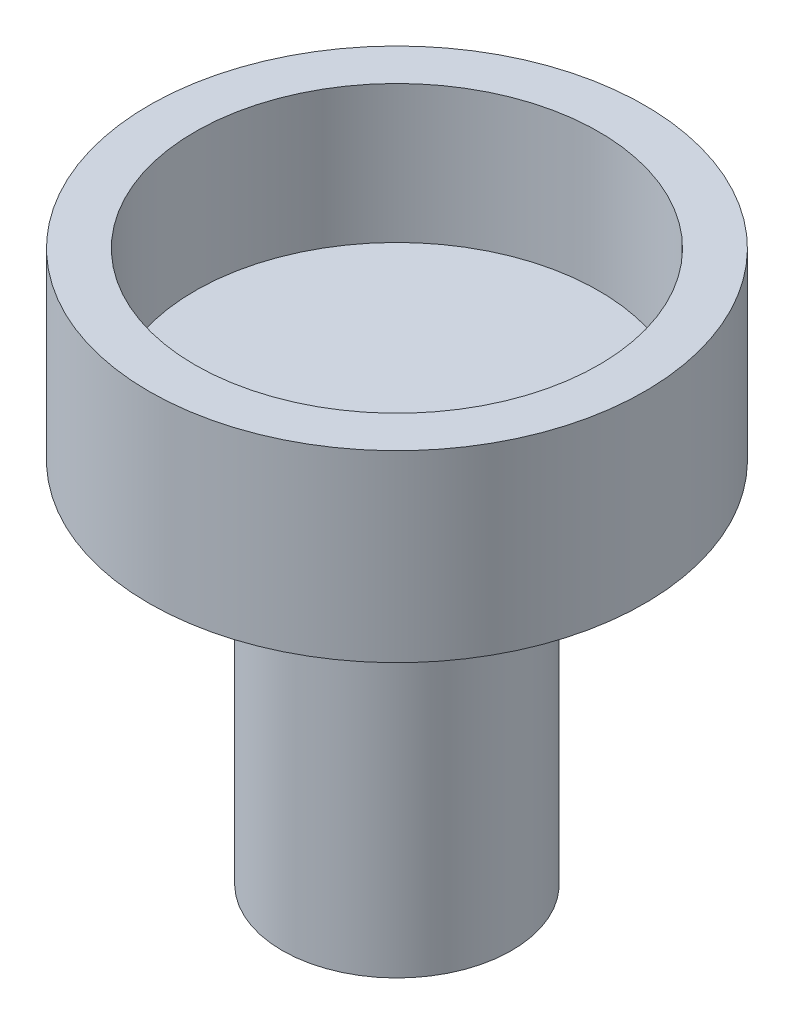
ISO-10303-21;
HEADER;
FILE_DESCRIPTION(('STEP AP214'),'2;1');
FILE_NAME('part.step','',(''),(''),'','','');
FILE_SCHEMA(('AUTOMOTIVE_DESIGN { 1 0 10303 214 1 1 1 1 }'));
ENDSEC;
DATA;
#1=APPLICATION_CONTEXT('core data for automotive mechanical design processes');
#2=APPLICATION_PROTOCOL_DEFINITION('international standard','automotive_design',2000,#1);
#3=PRODUCT_CONTEXT('',#1,'mechanical');
#4=PRODUCT('Part','Part','',(#3));
#5=PRODUCT_RELATED_PRODUCT_CATEGORY('part','',(#4));
#6=PRODUCT_DEFINITION_FORMATION('','',#4);
#7=PRODUCT_DEFINITION_CONTEXT('part definition',#1,'design');
#8=PRODUCT_DEFINITION('design','',#6,#7);
#9=PRODUCT_DEFINITION_SHAPE('','',#8);
#10=(LENGTH_UNIT() NAMED_UNIT(*) SI_UNIT(.MILLI.,.METRE.));
#11=(NAMED_UNIT(*) PLANE_ANGLE_UNIT() SI_UNIT($,.RADIAN.));
#12=(NAMED_UNIT(*) SI_UNIT($,.STERADIAN.) SOLID_ANGLE_UNIT());
#13=UNCERTAINTY_MEASURE_WITH_UNIT(LENGTH_MEASURE(1.E-05),#10,'distance_accuracy_value','');
#14=(GEOMETRIC_REPRESENTATION_CONTEXT(3) GLOBAL_UNCERTAINTY_ASSIGNED_CONTEXT((#13)) GLOBAL_UNIT_ASSIGNED_CONTEXT((#10,
#11,#12)) REPRESENTATION_CONTEXT('',''));
#15=CARTESIAN_POINT('',(0.,0.,0.));
#16=DIRECTION('',(0.,0.,1.));
#17=DIRECTION('',(1.,0.,0.));
#18=AXIS2_PLACEMENT_3D('',#15,#16,#17);
#19=CARTESIAN_POINT('',(0.,-4.,0.));
#20=DIRECTION('',(0.,1.,0.));
#21=DIRECTION('',(0.,0.,1.));
#22=AXIS2_PLACEMENT_3D('',#19,#20,#21);
#23=CYLINDRICAL_SURFACE('',#22,1.25);
#24=CARTESIAN_POINT('',(0.,-4.,0.));
#25=DIRECTION('',(0.,1.,0.));
#26=DIRECTION('',(0.,0.,1.));
#27=AXIS2_PLACEMENT_3D('',#24,#25,#26);
#28=CIRCLE('',#27,1.25);
#29=CARTESIAN_POINT('',(0.,-4.,1.25));
#30=VERTEX_POINT('',#29);
#31=EDGE_CURVE('E39',#30,#30,#28,.T.);
#32=ORIENTED_EDGE('',*,*,#31,.T.);
#33=EDGE_LOOP('',(#32));
#34=FACE_BOUND('',#33,.T.);
#35=CARTESIAN_POINT('',(0.,0.,0.));
#36=DIRECTION('',(0.,1.,0.));
#37=DIRECTION('',(0.,0.,1.));
#38=AXIS2_PLACEMENT_3D('',#35,#36,#37);
#39=CIRCLE('',#38,1.25);
#40=CARTESIAN_POINT('',(0.,0.,1.25));
#41=VERTEX_POINT('',#40);
#42=EDGE_CURVE('E43',#41,#41,#39,.T.);
#43=ORIENTED_EDGE('',*,*,#42,.F.);
#44=EDGE_LOOP('',(#43));
#45=FACE_BOUND('',#44,.T.);
#46=ADVANCED_FACE('F33',(#34,#45),#23,.T.);
#47=CARTESIAN_POINT('',(0.,-4.,0.));
#48=DIRECTION('',(0.,1.,0.));
#49=DIRECTION('',(0.,0.,1.));
#50=AXIS2_PLACEMENT_3D('',#47,#48,#49);
#51=PLANE('',#50);
#52=ORIENTED_EDGE('',*,*,#31,.F.);
#53=EDGE_LOOP('',(#52));
#54=FACE_BOUND('',#53,.T.);
#55=ADVANCED_FACE('F64',(#54),#51,.F.);
#56=CARTESIAN_POINT('',(0.,0.5,0.));
#57=DIRECTION('',(0.,-1.,0.));
#58=DIRECTION('',(0.,0.,-1.));
#59=AXIS2_PLACEMENT_3D('',#56,#57,#58);
#60=CYLINDRICAL_SURFACE('',#59,2.7);
#61=CARTESIAN_POINT('',(0.,0.,0.));
#62=DIRECTION('',(0.,1.,0.));
#63=DIRECTION('',(0.,0.,1.));
#64=AXIS2_PLACEMENT_3D('',#61,#62,#63);
#65=CIRCLE('',#64,2.7);
#66=CARTESIAN_POINT('',(0.,0.,2.7));
#67=VERTEX_POINT('',#66);
#68=EDGE_CURVE('E48',#67,#67,#65,.T.);
#69=ORIENTED_EDGE('',*,*,#68,.T.);
#70=EDGE_LOOP('',(#69));
#71=FACE_BOUND('',#70,.T.);
#72=CARTESIAN_POINT('',(0.,2.,0.));
#73=DIRECTION('',(0.,1.,0.));
#74=DIRECTION('',(0.,0.,1.));
#75=AXIS2_PLACEMENT_3D('',#72,#73,#74);
#76=CIRCLE('',#75,2.7);
#77=CARTESIAN_POINT('',(0.,2.,2.7));
#78=VERTEX_POINT('',#77);
#79=EDGE_CURVE('E52',#78,#78,#76,.T.);
#80=ORIENTED_EDGE('',*,*,#79,.F.);
#81=EDGE_LOOP('',(#80));
#82=FACE_BOUND('',#81,.T.);
#83=ADVANCED_FACE('F61',(#71,#82),#60,.T.);
#84=CARTESIAN_POINT('',(0.,0.,0.));
#85=DIRECTION('',(0.,1.,0.));
#86=DIRECTION('',(0.,0.,1.));
#87=AXIS2_PLACEMENT_3D('',#84,#85,#86);
#88=PLANE('',#87);
#89=ORIENTED_EDGE('',*,*,#42,.T.);
#90=EDGE_LOOP('',(#89));
#91=FACE_BOUND('',#90,.T.);
#92=ORIENTED_EDGE('',*,*,#68,.F.);
#93=EDGE_LOOP('',(#92));
#94=FACE_BOUND('',#93,.T.);
#95=ADVANCED_FACE('F63',(#91,#94),#88,.F.);
#96=CARTESIAN_POINT('',(0.,11.6367532368147,0.));
#97=DIRECTION('',(0.,-1.,0.));
#98=DIRECTION('',(0.,0.,-1.));
#99=AXIS2_PLACEMENT_3D('',#96,#97,#98);
#100=CYLINDRICAL_SURFACE('',#99,2.2);
#101=CARTESIAN_POINT('',(0.,0.5,0.));
#102=DIRECTION('',(0.,1.,0.));
#103=DIRECTION('',(0.,0.,1.));
#104=AXIS2_PLACEMENT_3D('',#101,#102,#103);
#105=CIRCLE('',#104,2.2);
#106=CARTESIAN_POINT('',(0.,0.5,2.2));
#107=VERTEX_POINT('',#106);
#108=EDGE_CURVE('E11',#107,#107,#105,.F.);
#109=ORIENTED_EDGE('',*,*,#108,.T.);
#110=EDGE_LOOP('',(#109));
#111=FACE_BOUND('',#110,.T.);
#112=CARTESIAN_POINT('',(0.,2.,0.));
#113=DIRECTION('',(0.,1.,0.));
#114=DIRECTION('',(0.,0.,1.));
#115=AXIS2_PLACEMENT_3D('',#112,#113,#114);
#116=CIRCLE('',#115,2.2);
#117=CARTESIAN_POINT('',(0.,2.,2.2));
#118=VERTEX_POINT('',#117);
#119=EDGE_CURVE('E53',#118,#118,#116,.T.);
#120=ORIENTED_EDGE('',*,*,#119,.T.);
#121=EDGE_LOOP('',(#120));
#122=FACE_BOUND('',#121,.T.);
#123=ADVANCED_FACE('F72',(#111,#122),#100,.F.);
#124=CARTESIAN_POINT('',(0.,2.,0.));
#125=DIRECTION('',(0.,1.,0.));
#126=DIRECTION('',(0.,0.,1.));
#127=AXIS2_PLACEMENT_3D('',#124,#125,#126);
#128=PLANE('',#127);
#129=ORIENTED_EDGE('',*,*,#119,.F.);
#130=EDGE_LOOP('',(#129));
#131=FACE_BOUND('',#130,.T.);
#132=ORIENTED_EDGE('',*,*,#79,.T.);
#133=EDGE_LOOP('',(#132));
#134=FACE_BOUND('',#133,.T.);
#135=ADVANCED_FACE('F59',(#131,#134),#128,.T.);
#136=CARTESIAN_POINT('',(0.,0.5,0.));
#137=DIRECTION('',(0.,1.,0.));
#138=DIRECTION('',(0.,0.,1.));
#139=AXIS2_PLACEMENT_3D('',#136,#137,#138);
#140=PLANE('',#139);
#141=ORIENTED_EDGE('',*,*,#108,.F.);
#142=EDGE_LOOP('',(#141));
#143=FACE_BOUND('',#142,.T.);
#144=ADVANCED_FACE('F94',(#143),#140,.T.);
#145=CLOSED_SHELL('',(#46,#55,#83,#95,#123,#135,#144));
#146=MANIFOLD_SOLID_BREP('B2',#145);
#147=ADVANCED_BREP_SHAPE_REPRESENTATION('',(#18,#146),#14);
#148=SHAPE_DEFINITION_REPRESENTATION(#9,#147);
ENDSEC;
END-ISO-10303-21;
